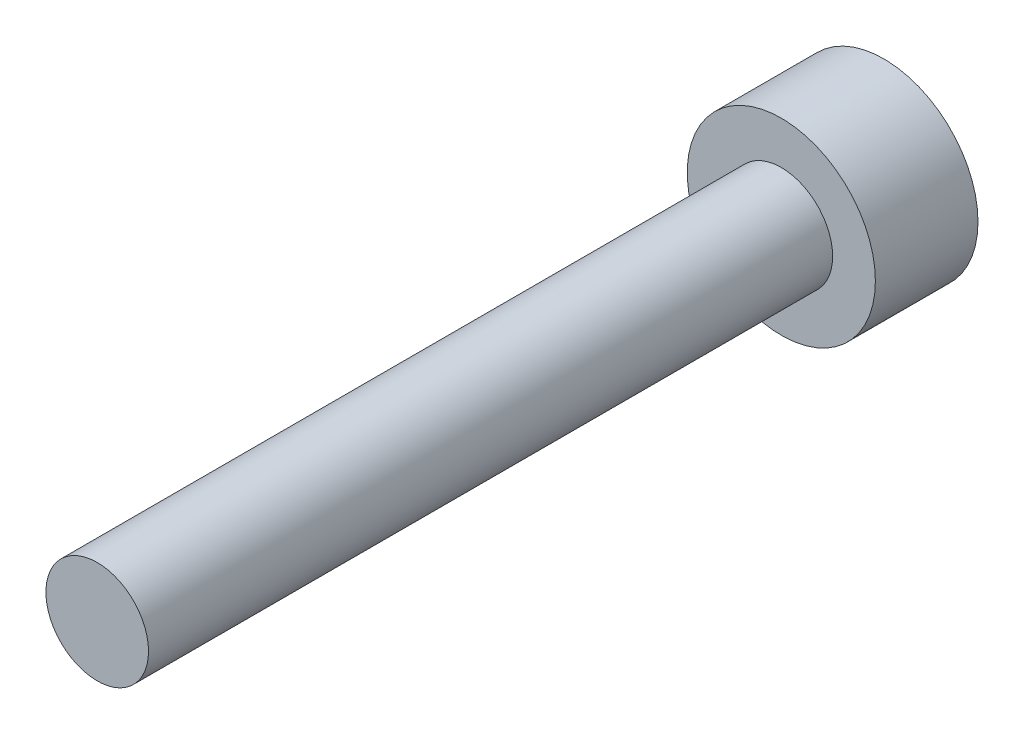
ISO-10303-21;
HEADER;
FILE_DESCRIPTION(('STEP AP214'),'2;1');
FILE_NAME('part.step','',(''),(''),'','','');
FILE_SCHEMA(('AUTOMOTIVE_DESIGN { 1 0 10303 214 1 1 1 1 }'));
ENDSEC;
DATA;
#1=APPLICATION_CONTEXT('core data for automotive mechanical design processes');
#2=APPLICATION_PROTOCOL_DEFINITION('international standard','automotive_design',2000,#1);
#3=PRODUCT_CONTEXT('',#1,'mechanical');
#4=PRODUCT('Part','Part','',(#3));
#5=PRODUCT_RELATED_PRODUCT_CATEGORY('part','',(#4));
#6=PRODUCT_DEFINITION_FORMATION('','',#4);
#7=PRODUCT_DEFINITION_CONTEXT('part definition',#1,'design');
#8=PRODUCT_DEFINITION('design','',#6,#7);
#9=PRODUCT_DEFINITION_SHAPE('','',#8);
#10=(LENGTH_UNIT() NAMED_UNIT(*) SI_UNIT(.MILLI.,.METRE.));
#11=(NAMED_UNIT(*) PLANE_ANGLE_UNIT() SI_UNIT($,.RADIAN.));
#12=(NAMED_UNIT(*) SI_UNIT($,.STERADIAN.) SOLID_ANGLE_UNIT());
#13=UNCERTAINTY_MEASURE_WITH_UNIT(LENGTH_MEASURE(1.E-05),#10,'distance_accuracy_value','');
#14=(GEOMETRIC_REPRESENTATION_CONTEXT(3) GLOBAL_UNCERTAINTY_ASSIGNED_CONTEXT((#13)) GLOBAL_UNIT_ASSIGNED_CONTEXT((#10,
#11,#12)) REPRESENTATION_CONTEXT('',''));
#15=CARTESIAN_POINT('',(0.,0.,0.));
#16=DIRECTION('',(0.,0.,1.));
#17=DIRECTION('',(1.,0.,0.));
#18=AXIS2_PLACEMENT_3D('',#15,#16,#17);
#19=CARTESIAN_POINT('',(0.,0.,-3.));
#20=DIRECTION('',(0.,0.,1.));
#21=DIRECTION('',(1.,0.,0.));
#22=AXIS2_PLACEMENT_3D('',#19,#20,#21);
#23=PLANE('',#22);
#24=CARTESIAN_POINT('',(0.,0.,-3.));
#25=DIRECTION('',(0.,0.,1.));
#26=DIRECTION('',(1.,0.,0.));
#27=AXIS2_PLACEMENT_3D('',#24,#25,#26);
#28=CIRCLE('',#27,2.75);
#29=CARTESIAN_POINT('',(2.75,0.,-3.));
#30=VERTEX_POINT('',#29);
#31=EDGE_CURVE('E112',#30,#30,#28,.T.);
#32=ORIENTED_EDGE('',*,*,#31,.F.);
#33=EDGE_LOOP('',(#32));
#34=FACE_BOUND('',#33,.T.);
#35=DIRECTION('',(-0.5,-0.866025403784439,0.));
#36=VECTOR('',#35,1.);
#37=CARTESIAN_POINT('',(1.08253175473055,-0.625,-3.));
#38=LINE('',#37,#36);
#39=CARTESIAN_POINT('',(1.44337567297406,0.,-3.));
#40=VERTEX_POINT('',#39);
#41=CARTESIAN_POINT('',(0.721687836487032,-1.25,-3.));
#42=VERTEX_POINT('',#41);
#43=EDGE_CURVE('E11',#40,#42,#38,.T.);
#44=ORIENTED_EDGE('',*,*,#43,.F.);
#45=DIRECTION('',(0.5,-0.866025403784439,0.));
#46=VECTOR('',#45,1.);
#47=CARTESIAN_POINT('',(1.08253175473055,0.625,-3.));
#48=LINE('',#47,#46);
#49=CARTESIAN_POINT('',(0.721687836487032,1.25,-3.));
#50=VERTEX_POINT('',#49);
#51=EDGE_CURVE('E50',#50,#40,#48,.T.);
#52=ORIENTED_EDGE('',*,*,#51,.F.);
#53=DIRECTION('',(1.,0.,0.));
#54=VECTOR('',#53,1.);
#55=CARTESIAN_POINT('',(0.,1.25,-3.));
#56=LINE('',#55,#54);
#57=CARTESIAN_POINT('',(-0.721687836487032,1.25,-3.));
#58=VERTEX_POINT('',#57);
#59=EDGE_CURVE('E133',#58,#50,#56,.T.);
#60=ORIENTED_EDGE('',*,*,#59,.F.);
#61=DIRECTION('',(0.5,0.866025403784439,0.));
#62=VECTOR('',#61,1.);
#63=CARTESIAN_POINT('',(-1.08253175473055,0.625,-3.));
#64=LINE('',#63,#62);
#65=CARTESIAN_POINT('',(-1.44337567297406,0.,-3.));
#66=VERTEX_POINT('',#65);
#67=EDGE_CURVE('E129',#66,#58,#64,.T.);
#68=ORIENTED_EDGE('',*,*,#67,.F.);
#69=DIRECTION('',(-0.5,0.866025403784439,0.));
#70=VECTOR('',#69,1.);
#71=CARTESIAN_POINT('',(-1.08253175473055,-0.624999999999999,-3.));
#72=LINE('',#71,#70);
#73=CARTESIAN_POINT('',(-0.721687836487033,-1.25,-3.));
#74=VERTEX_POINT('',#73);
#75=EDGE_CURVE('E130',#74,#66,#72,.T.);
#76=ORIENTED_EDGE('',*,*,#75,.F.);
#77=DIRECTION('',(-1.,0.,0.));
#78=VECTOR('',#77,1.);
#79=CARTESIAN_POINT('',(0.,-1.25,-3.));
#80=LINE('',#79,#78);
#81=EDGE_CURVE('E116',#42,#74,#80,.T.);
#82=ORIENTED_EDGE('',*,*,#81,.F.);
#83=EDGE_LOOP('',(#44,#52,#60,#68,#76,#82));
#84=FACE_BOUND('',#83,.T.);
#85=ADVANCED_FACE('F39',(#34,#84),#23,.F.);
#86=CARTESIAN_POINT('',(0.,0.,0.));
#87=DIRECTION('',(0.,0.,-1.));
#88=DIRECTION('',(-1.,0.,0.));
#89=AXIS2_PLACEMENT_3D('',#86,#87,#88);
#90=CYLINDRICAL_SURFACE('',#89,2.75);
#91=CARTESIAN_POINT('',(0.,0.,0.));
#92=DIRECTION('',(0.,0.,1.));
#93=DIRECTION('',(1.,0.,0.));
#94=AXIS2_PLACEMENT_3D('',#91,#92,#93);
#95=CIRCLE('',#94,2.75);
#96=CARTESIAN_POINT('',(2.75,0.,0.));
#97=VERTEX_POINT('',#96);
#98=EDGE_CURVE('E121',#97,#97,#95,.T.);
#99=ORIENTED_EDGE('',*,*,#98,.F.);
#100=EDGE_LOOP('',(#99));
#101=FACE_BOUND('',#100,.T.);
#102=ORIENTED_EDGE('',*,*,#31,.T.);
#103=EDGE_LOOP('',(#102));
#104=FACE_BOUND('',#103,.T.);
#105=ADVANCED_FACE('F41',(#101,#104),#90,.T.);
#106=CARTESIAN_POINT('',(0.,0.,0.));
#107=DIRECTION('',(0.,0.,1.));
#108=DIRECTION('',(1.,0.,0.));
#109=AXIS2_PLACEMENT_3D('',#106,#107,#108);
#110=PLANE('',#109);
#111=CARTESIAN_POINT('',(0.,0.,0.));
#112=DIRECTION('',(0.,0.,1.));
#113=DIRECTION('',(1.,0.,0.));
#114=AXIS2_PLACEMENT_3D('',#111,#112,#113);
#115=CIRCLE('',#114,1.5);
#116=CARTESIAN_POINT('',(1.5,0.,0.));
#117=VERTEX_POINT('',#116);
#118=EDGE_CURVE('E119',#117,#117,#115,.T.);
#119=ORIENTED_EDGE('',*,*,#118,.F.);
#120=EDGE_LOOP('',(#119));
#121=FACE_BOUND('',#120,.T.);
#122=ORIENTED_EDGE('',*,*,#98,.T.);
#123=EDGE_LOOP('',(#122));
#124=FACE_BOUND('',#123,.T.);
#125=ADVANCED_FACE('F177',(#121,#124),#110,.T.);
#126=CARTESIAN_POINT('',(0.,0.,20.));
#127=DIRECTION('',(0.,0.,-1.));
#128=DIRECTION('',(-1.,0.,0.));
#129=AXIS2_PLACEMENT_3D('',#126,#127,#128);
#130=CYLINDRICAL_SURFACE('',#129,1.5);
#131=CARTESIAN_POINT('',(0.,0.,20.));
#132=DIRECTION('',(0.,0.,1.));
#133=DIRECTION('',(1.,0.,0.));
#134=AXIS2_PLACEMENT_3D('',#131,#132,#133);
#135=CIRCLE('',#134,1.5);
#136=CARTESIAN_POINT('',(1.5,0.,20.));
#137=VERTEX_POINT('',#136);
#138=EDGE_CURVE('E110',#137,#137,#135,.T.);
#139=ORIENTED_EDGE('',*,*,#138,.F.);
#140=EDGE_LOOP('',(#139));
#141=FACE_BOUND('',#140,.T.);
#142=ORIENTED_EDGE('',*,*,#118,.T.);
#143=EDGE_LOOP('',(#142));
#144=FACE_BOUND('',#143,.T.);
#145=ADVANCED_FACE('F184',(#141,#144),#130,.T.);
#146=CARTESIAN_POINT('',(0.,0.,20.));
#147=DIRECTION('',(0.,0.,1.));
#148=DIRECTION('',(1.,0.,0.));
#149=AXIS2_PLACEMENT_3D('',#146,#147,#148);
#150=PLANE('',#149);
#151=ORIENTED_EDGE('',*,*,#138,.T.);
#152=EDGE_LOOP('',(#151));
#153=FACE_BOUND('',#152,.T.);
#154=ADVANCED_FACE('F187',(#153),#150,.T.);
#155=CARTESIAN_POINT('',(0.721687836487032,-1.25,-1.35));
#156=DIRECTION('',(-0.866025403784439,0.5,0.));
#157=DIRECTION('',(-0.5,-0.866025403784439,0.));
#158=AXIS2_PLACEMENT_3D('',#155,#156,#157);
#159=PLANE('',#158);
#160=ORIENTED_EDGE('',*,*,#43,.T.);
#161=DIRECTION('',(0.,0.,-1.));
#162=VECTOR('',#161,1.);
#163=CARTESIAN_POINT('',(0.721687836487032,-1.25,-1.35));
#164=LINE('',#163,#162);
#165=CARTESIAN_POINT('',(0.721687836487032,-1.25,-1.35));
#166=VERTEX_POINT('',#165);
#167=EDGE_CURVE('E53',#166,#42,#164,.T.);
#168=ORIENTED_EDGE('',*,*,#167,.F.);
#169=DIRECTION('',(0.5,0.866025403784439,0.));
#170=VECTOR('',#169,1.);
#171=CARTESIAN_POINT('',(0.721687836487032,-1.25,-1.35));
#172=LINE('',#171,#170);
#173=CARTESIAN_POINT('',(1.44337567297406,0.,-1.35));
#174=VERTEX_POINT('',#173);
#175=EDGE_CURVE('E96',#166,#174,#172,.T.);
#176=ORIENTED_EDGE('',*,*,#175,.T.);
#177=DIRECTION('',(0.,0.,-1.));
#178=VECTOR('',#177,1.);
#179=CARTESIAN_POINT('',(1.44337567297406,0.,-1.35));
#180=LINE('',#179,#178);
#181=EDGE_CURVE('E103',#174,#40,#180,.T.);
#182=ORIENTED_EDGE('',*,*,#181,.T.);
#183=EDGE_LOOP('',(#160,#168,#176,#182));
#184=FACE_BOUND('',#183,.T.);
#185=ADVANCED_FACE('F105',(#184),#159,.T.);
#186=CARTESIAN_POINT('',(1.44337567297406,0.,-1.35));
#187=DIRECTION('',(-0.866025403784439,-0.5,0.));
#188=DIRECTION('',(0.5,-0.866025403784439,0.));
#189=AXIS2_PLACEMENT_3D('',#186,#187,#188);
#190=PLANE('',#189);
#191=ORIENTED_EDGE('',*,*,#51,.T.);
#192=ORIENTED_EDGE('',*,*,#181,.F.);
#193=DIRECTION('',(-0.5,0.866025403784439,0.));
#194=VECTOR('',#193,1.);
#195=CARTESIAN_POINT('',(1.44337567297406,0.,-1.35));
#196=LINE('',#195,#194);
#197=CARTESIAN_POINT('',(0.721687836487032,1.25,-1.35));
#198=VERTEX_POINT('',#197);
#199=EDGE_CURVE('E95',#174,#198,#196,.T.);
#200=ORIENTED_EDGE('',*,*,#199,.T.);
#201=DIRECTION('',(0.,0.,-1.));
#202=VECTOR('',#201,1.);
#203=CARTESIAN_POINT('',(0.721687836487032,1.25,-1.35));
#204=LINE('',#203,#202);
#205=EDGE_CURVE('E107',#198,#50,#204,.T.);
#206=ORIENTED_EDGE('',*,*,#205,.T.);
#207=EDGE_LOOP('',(#191,#192,#200,#206));
#208=FACE_BOUND('',#207,.T.);
#209=ADVANCED_FACE('F106',(#208),#190,.T.);
#210=CARTESIAN_POINT('',(0.721687836487032,1.25,-1.35));
#211=DIRECTION('',(0.,-1.,0.));
#212=DIRECTION('',(1.,0.,0.));
#213=AXIS2_PLACEMENT_3D('',#210,#211,#212);
#214=PLANE('',#213);
#215=ORIENTED_EDGE('',*,*,#59,.T.);
#216=ORIENTED_EDGE('',*,*,#205,.F.);
#217=DIRECTION('',(-1.,0.,0.));
#218=VECTOR('',#217,1.);
#219=CARTESIAN_POINT('',(0.721687836487032,1.25,-1.35));
#220=LINE('',#219,#218);
#221=CARTESIAN_POINT('',(-0.721687836487032,1.25,-1.35));
#222=VERTEX_POINT('',#221);
#223=EDGE_CURVE('E98',#198,#222,#220,.T.);
#224=ORIENTED_EDGE('',*,*,#223,.T.);
#225=DIRECTION('',(0.,0.,-1.));
#226=VECTOR('',#225,1.);
#227=CARTESIAN_POINT('',(-0.721687836487032,1.25,-1.35));
#228=LINE('',#227,#226);
#229=EDGE_CURVE('E114',#222,#58,#228,.T.);
#230=ORIENTED_EDGE('',*,*,#229,.T.);
#231=EDGE_LOOP('',(#215,#216,#224,#230));
#232=FACE_BOUND('',#231,.T.);
#233=ADVANCED_FACE('F131',(#232),#214,.T.);
#234=CARTESIAN_POINT('',(-0.721687836487032,1.25,-1.35));
#235=DIRECTION('',(0.866025403784439,-0.5,0.));
#236=DIRECTION('',(0.5,0.866025403784439,0.));
#237=AXIS2_PLACEMENT_3D('',#234,#235,#236);
#238=PLANE('',#237);
#239=ORIENTED_EDGE('',*,*,#67,.T.);
#240=ORIENTED_EDGE('',*,*,#229,.F.);
#241=DIRECTION('',(-0.5,-0.866025403784439,0.));
#242=VECTOR('',#241,1.);
#243=CARTESIAN_POINT('',(-0.721687836487032,1.25,-1.35));
#244=LINE('',#243,#242);
#245=CARTESIAN_POINT('',(-1.44337567297406,0.,-1.35));
#246=VERTEX_POINT('',#245);
#247=EDGE_CURVE('E157',#222,#246,#244,.T.);
#248=ORIENTED_EDGE('',*,*,#247,.T.);
#249=DIRECTION('',(0.,0.,-1.));
#250=VECTOR('',#249,1.);
#251=CARTESIAN_POINT('',(-1.44337567297406,0.,-1.35));
#252=LINE('',#251,#250);
#253=EDGE_CURVE('E151',#246,#66,#252,.T.);
#254=ORIENTED_EDGE('',*,*,#253,.T.);
#255=EDGE_LOOP('',(#239,#240,#248,#254));
#256=FACE_BOUND('',#255,.T.);
#257=ADVANCED_FACE('F165',(#256),#238,.T.);
#258=CARTESIAN_POINT('',(-1.44337567297406,0.,-1.35));
#259=DIRECTION('',(0.866025403784439,0.5,0.));
#260=DIRECTION('',(-0.5,0.866025403784439,0.));
#261=AXIS2_PLACEMENT_3D('',#258,#259,#260);
#262=PLANE('',#261);
#263=ORIENTED_EDGE('',*,*,#75,.T.);
#264=ORIENTED_EDGE('',*,*,#253,.F.);
#265=DIRECTION('',(0.5,-0.866025403784439,0.));
#266=VECTOR('',#265,1.);
#267=CARTESIAN_POINT('',(-1.44337567297406,0.,-1.35));
#268=LINE('',#267,#266);
#269=CARTESIAN_POINT('',(-0.721687836487033,-1.25,-1.35));
#270=VERTEX_POINT('',#269);
#271=EDGE_CURVE('E147',#246,#270,#268,.T.);
#272=ORIENTED_EDGE('',*,*,#271,.T.);
#273=DIRECTION('',(0.,0.,-1.));
#274=VECTOR('',#273,1.);
#275=CARTESIAN_POINT('',(-0.721687836487033,-1.25,-1.35));
#276=LINE('',#275,#274);
#277=EDGE_CURVE('E145',#270,#74,#276,.T.);
#278=ORIENTED_EDGE('',*,*,#277,.T.);
#279=EDGE_LOOP('',(#263,#264,#272,#278));
#280=FACE_BOUND('',#279,.T.);
#281=ADVANCED_FACE('F148',(#280),#262,.T.);
#282=CARTESIAN_POINT('',(-0.721687836487033,-1.25,-1.35));
#283=DIRECTION('',(0.,1.,0.));
#284=DIRECTION('',(-1.,0.,0.));
#285=AXIS2_PLACEMENT_3D('',#282,#283,#284);
#286=PLANE('',#285);
#287=ORIENTED_EDGE('',*,*,#81,.T.);
#288=ORIENTED_EDGE('',*,*,#277,.F.);
#289=DIRECTION('',(1.,0.,0.));
#290=VECTOR('',#289,1.);
#291=CARTESIAN_POINT('',(-0.721687836487033,-1.25,-1.35));
#292=LINE('',#291,#290);
#293=EDGE_CURVE('E152',#270,#166,#292,.T.);
#294=ORIENTED_EDGE('',*,*,#293,.T.);
#295=ORIENTED_EDGE('',*,*,#167,.T.);
#296=EDGE_LOOP('',(#287,#288,#294,#295));
#297=FACE_BOUND('',#296,.T.);
#298=ADVANCED_FACE('F141',(#297),#286,.T.);
#299=CARTESIAN_POINT('',(0.,0.,-1.35));
#300=DIRECTION('',(0.,0.,1.));
#301=DIRECTION('',(1.,0.,0.));
#302=AXIS2_PLACEMENT_3D('',#299,#300,#301);
#303=PLANE('',#302);
#304=ORIENTED_EDGE('',*,*,#175,.F.);
#305=ORIENTED_EDGE('',*,*,#293,.F.);
#306=ORIENTED_EDGE('',*,*,#271,.F.);
#307=ORIENTED_EDGE('',*,*,#247,.F.);
#308=ORIENTED_EDGE('',*,*,#223,.F.);
#309=ORIENTED_EDGE('',*,*,#199,.F.);
#310=EDGE_LOOP('',(#304,#305,#306,#307,#308,#309));
#311=FACE_BOUND('',#310,.T.);
#312=ADVANCED_FACE('F94',(#311),#303,.F.);
#313=CLOSED_SHELL('',(#85,#105,#125,#145,#154,#185,#209,#233,#257,#281,#298,#312));
#314=MANIFOLD_SOLID_BREP('B2',#313);
#315=ADVANCED_BREP_SHAPE_REPRESENTATION('',(#18,#314),#14);
#316=SHAPE_DEFINITION_REPRESENTATION(#9,#315);
ENDSEC;
END-ISO-10303-21;
